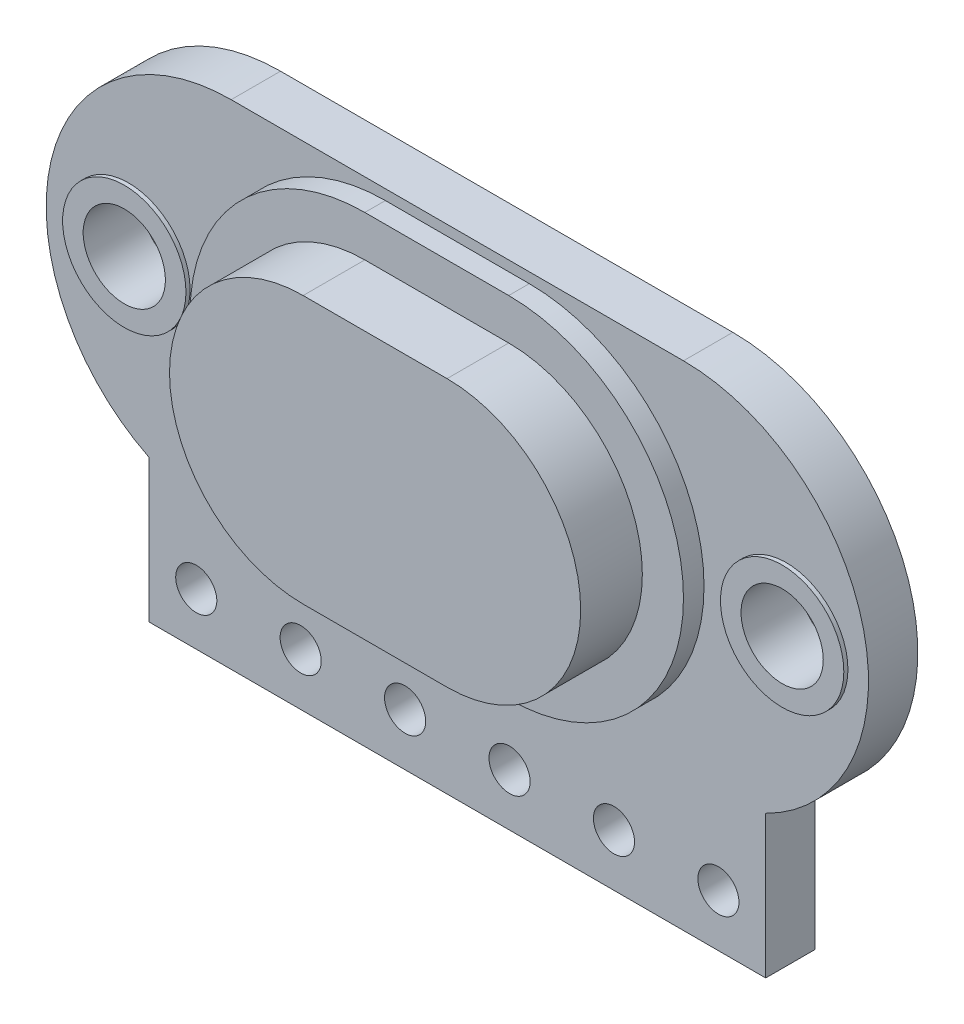
ISO-10303-21;
HEADER;
FILE_DESCRIPTION(('STEP AP214'),'2;1');
FILE_NAME('part.step','',(''),(''),'','','');
FILE_SCHEMA(('AUTOMOTIVE_DESIGN { 1 0 10303 214 1 1 1 1 }'));
ENDSEC;
DATA;
#1=APPLICATION_CONTEXT('core data for automotive mechanical design processes');
#2=APPLICATION_PROTOCOL_DEFINITION('international standard','automotive_design',2000,#1);
#3=PRODUCT_CONTEXT('',#1,'mechanical');
#4=PRODUCT('Part','Part','',(#3));
#5=PRODUCT_RELATED_PRODUCT_CATEGORY('part','',(#4));
#6=PRODUCT_DEFINITION_FORMATION('','',#4);
#7=PRODUCT_DEFINITION_CONTEXT('part definition',#1,'design');
#8=PRODUCT_DEFINITION('design','',#6,#7);
#9=PRODUCT_DEFINITION_SHAPE('','',#8);
#10=(LENGTH_UNIT() NAMED_UNIT(*) SI_UNIT(.MILLI.,.METRE.));
#11=(NAMED_UNIT(*) PLANE_ANGLE_UNIT() SI_UNIT($,.RADIAN.));
#12=(NAMED_UNIT(*) SI_UNIT($,.STERADIAN.) SOLID_ANGLE_UNIT());
#13=UNCERTAINTY_MEASURE_WITH_UNIT(LENGTH_MEASURE(1.E-05),#10,'distance_accuracy_value','');
#14=(GEOMETRIC_REPRESENTATION_CONTEXT(3) GLOBAL_UNCERTAINTY_ASSIGNED_CONTEXT((#13)) GLOBAL_UNIT_ASSIGNED_CONTEXT((#10,
#11,#12)) REPRESENTATION_CONTEXT('',''));
#15=CARTESIAN_POINT('',(0.,0.,0.));
#16=DIRECTION('',(0.,0.,1.));
#17=DIRECTION('',(1.,0.,0.));
#18=AXIS2_PLACEMENT_3D('',#15,#16,#17);
#19=CARTESIAN_POINT('',(-5.5,0.,0.6));
#20=DIRECTION('',(0.,0.,1.));
#21=DIRECTION('',(1.,0.,0.));
#22=AXIS2_PLACEMENT_3D('',#19,#20,#21);
#23=PLANE('',#22);
#24=DIRECTION('',(0.,1.,0.));
#25=VECTOR('',#24,1.);
#26=CARTESIAN_POINT('',(7.5,-4.03112887414927,0.6));
#27=LINE('',#26,#25);
#28=CARTESIAN_POINT('',(7.5,-7.5,0.6));
#29=VERTEX_POINT('',#28);
#30=CARTESIAN_POINT('',(7.5,-4.03112887414928,0.6));
#31=VERTEX_POINT('',#30);
#32=EDGE_CURVE('E234',#29,#31,#27,.T.);
#33=ORIENTED_EDGE('',*,*,#32,.T.);
#34=CARTESIAN_POINT('',(5.5,0.,0.6));
#35=DIRECTION('',(0.,0.,1.));
#36=DIRECTION('',(1.,0.,0.));
#37=AXIS2_PLACEMENT_3D('',#34,#35,#36);
#38=CIRCLE('',#37,4.5);
#39=CARTESIAN_POINT('',(5.5,4.5,0.6));
#40=VERTEX_POINT('',#39);
#41=EDGE_CURVE('E240',#31,#40,#38,.T.);
#42=ORIENTED_EDGE('',*,*,#41,.T.);
#43=DIRECTION('',(-1.,0.,0.));
#44=VECTOR('',#43,1.);
#45=CARTESIAN_POINT('',(-5.5,4.5,0.6));
#46=LINE('',#45,#44);
#47=CARTESIAN_POINT('',(-5.5,4.5,0.6));
#48=VERTEX_POINT('',#47);
#49=EDGE_CURVE('E239',#40,#48,#46,.T.);
#50=ORIENTED_EDGE('',*,*,#49,.T.);
#51=CARTESIAN_POINT('',(-5.5,0.,0.6));
#52=DIRECTION('',(0.,0.,1.));
#53=DIRECTION('',(1.,0.,0.));
#54=AXIS2_PLACEMENT_3D('',#51,#52,#53);
#55=CIRCLE('',#54,4.5);
#56=CARTESIAN_POINT('',(-7.5,-4.03112887414927,0.6));
#57=VERTEX_POINT('',#56);
#58=EDGE_CURVE('E224',#48,#57,#55,.T.);
#59=ORIENTED_EDGE('',*,*,#58,.T.);
#60=DIRECTION('',(0.,-1.,0.));
#61=VECTOR('',#60,1.);
#62=CARTESIAN_POINT('',(-7.5,-4.03112887414927,0.6));
#63=LINE('',#62,#61);
#64=CARTESIAN_POINT('',(-7.5,-7.5,0.6));
#65=VERTEX_POINT('',#64);
#66=EDGE_CURVE('E227',#57,#65,#63,.T.);
#67=ORIENTED_EDGE('',*,*,#66,.T.);
#68=DIRECTION('',(1.,0.,0.));
#69=VECTOR('',#68,1.);
#70=CARTESIAN_POINT('',(-7.5,-7.5,0.6));
#71=LINE('',#70,#69);
#72=EDGE_CURVE('E233',#65,#29,#71,.T.);
#73=ORIENTED_EDGE('',*,*,#72,.T.);
#74=EDGE_LOOP('',(#33,#42,#50,#59,#67,#73));
#75=FACE_BOUND('',#74,.T.);
#76=CARTESIAN_POINT('',(-8.,0.,0.6));
#77=DIRECTION('',(0.,0.,1.));
#78=DIRECTION('',(1.,0.,0.));
#79=AXIS2_PLACEMENT_3D('',#76,#77,#78);
#80=CIRCLE('',#79,1.5);
#81=CARTESIAN_POINT('',(-6.5,0.,0.6));
#82=VERTEX_POINT('',#81);
#83=EDGE_CURVE('E463',#82,#82,#80,.T.);
#84=ORIENTED_EDGE('',*,*,#83,.F.);
#85=EDGE_LOOP('',(#84));
#86=FACE_BOUND('',#85,.T.);
#87=DIRECTION('',(1.,0.,0.));
#88=VECTOR('',#87,1.);
#89=CARTESIAN_POINT('',(-1.75,-4.25,0.6));
#90=LINE('',#89,#88);
#91=CARTESIAN_POINT('',(-1.75,-4.25,0.6));
#92=VERTEX_POINT('',#91);
#93=CARTESIAN_POINT('',(1.75,-4.25,0.6));
#94=VERTEX_POINT('',#93);
#95=EDGE_CURVE('E179',#92,#94,#90,.T.);
#96=ORIENTED_EDGE('',*,*,#95,.F.);
#97=CARTESIAN_POINT('',(-1.75,0.,0.6));
#98=DIRECTION('',(0.,0.,1.));
#99=DIRECTION('',(1.,0.,0.));
#100=AXIS2_PLACEMENT_3D('',#97,#98,#99);
#101=CIRCLE('',#100,4.25);
#102=CARTESIAN_POINT('',(-1.75,4.25,0.6));
#103=VERTEX_POINT('',#102);
#104=EDGE_CURVE('E174',#103,#92,#101,.T.);
#105=ORIENTED_EDGE('',*,*,#104,.F.);
#106=DIRECTION('',(-1.,0.,0.));
#107=VECTOR('',#106,1.);
#108=CARTESIAN_POINT('',(-1.75,4.25,0.6));
#109=LINE('',#108,#107);
#110=CARTESIAN_POINT('',(1.75,4.25,0.6));
#111=VERTEX_POINT('',#110);
#112=EDGE_CURVE('E192',#111,#103,#109,.T.);
#113=ORIENTED_EDGE('',*,*,#112,.F.);
#114=CARTESIAN_POINT('',(1.75,0.,0.6));
#115=DIRECTION('',(0.,0.,1.));
#116=DIRECTION('',(1.,0.,0.));
#117=AXIS2_PLACEMENT_3D('',#114,#115,#116);
#118=CIRCLE('',#117,4.25);
#119=EDGE_CURVE('E204',#94,#111,#118,.T.);
#120=ORIENTED_EDGE('',*,*,#119,.F.);
#121=EDGE_LOOP('',(#96,#105,#113,#120));
#122=FACE_BOUND('',#121,.T.);
#123=CARTESIAN_POINT('',(8.,0.,0.6));
#124=DIRECTION('',(0.,0.,1.));
#125=DIRECTION('',(1.,0.,0.));
#126=AXIS2_PLACEMENT_3D('',#123,#124,#125);
#127=CIRCLE('',#126,1.5);
#128=CARTESIAN_POINT('',(9.5,0.,0.6));
#129=VERTEX_POINT('',#128);
#130=EDGE_CURVE('E455',#129,#129,#127,.T.);
#131=ORIENTED_EDGE('',*,*,#130,.F.);
#132=EDGE_LOOP('',(#131));
#133=FACE_BOUND('',#132,.T.);
#134=CARTESIAN_POINT('',(6.35,-6.23,0.6));
#135=DIRECTION('',(0.,0.,-1.));
#136=DIRECTION('',(-1.,0.,0.));
#137=AXIS2_PLACEMENT_3D('',#134,#135,#136);
#138=CIRCLE('',#137,0.500000000000001);
#139=CARTESIAN_POINT('',(5.85,-6.23,0.6));
#140=VERTEX_POINT('',#139);
#141=EDGE_CURVE('E509',#140,#140,#138,.T.);
#142=ORIENTED_EDGE('',*,*,#141,.T.);
#143=EDGE_LOOP('',(#142));
#144=FACE_BOUND('',#143,.T.);
#145=CARTESIAN_POINT('',(3.81,-6.23,0.6));
#146=DIRECTION('',(0.,0.,-1.));
#147=DIRECTION('',(-1.,0.,0.));
#148=AXIS2_PLACEMENT_3D('',#145,#146,#147);
#149=CIRCLE('',#148,0.500000000000001);
#150=CARTESIAN_POINT('',(3.31,-6.23,0.6));
#151=VERTEX_POINT('',#150);
#152=EDGE_CURVE('E511',#151,#151,#149,.T.);
#153=ORIENTED_EDGE('',*,*,#152,.T.);
#154=EDGE_LOOP('',(#153));
#155=FACE_BOUND('',#154,.T.);
#156=CARTESIAN_POINT('',(1.27,-6.23,0.6));
#157=DIRECTION('',(0.,0.,-1.));
#158=DIRECTION('',(-1.,0.,0.));
#159=AXIS2_PLACEMENT_3D('',#156,#157,#158);
#160=CIRCLE('',#159,0.500000000000001);
#161=CARTESIAN_POINT('',(0.769999999999999,-6.23,0.6));
#162=VERTEX_POINT('',#161);
#163=EDGE_CURVE('E519',#162,#162,#160,.T.);
#164=ORIENTED_EDGE('',*,*,#163,.T.);
#165=EDGE_LOOP('',(#164));
#166=FACE_BOUND('',#165,.T.);
#167=CARTESIAN_POINT('',(-1.27,-6.23,0.6));
#168=DIRECTION('',(0.,0.,-1.));
#169=DIRECTION('',(-1.,0.,0.));
#170=AXIS2_PLACEMENT_3D('',#167,#168,#169);
#171=CIRCLE('',#170,0.500000000000001);
#172=CARTESIAN_POINT('',(-1.77,-6.23,0.6));
#173=VERTEX_POINT('',#172);
#174=EDGE_CURVE('E525',#173,#173,#171,.T.);
#175=ORIENTED_EDGE('',*,*,#174,.T.);
#176=EDGE_LOOP('',(#175));
#177=FACE_BOUND('',#176,.T.);
#178=CARTESIAN_POINT('',(-3.81,-6.23,0.6));
#179=DIRECTION('',(0.,0.,-1.));
#180=DIRECTION('',(-1.,0.,0.));
#181=AXIS2_PLACEMENT_3D('',#178,#179,#180);
#182=CIRCLE('',#181,0.500000000000001);
#183=CARTESIAN_POINT('',(-4.31,-6.23,0.6));
#184=VERTEX_POINT('',#183);
#185=EDGE_CURVE('E526',#184,#184,#182,.T.);
#186=ORIENTED_EDGE('',*,*,#185,.T.);
#187=EDGE_LOOP('',(#186));
#188=FACE_BOUND('',#187,.T.);
#189=CARTESIAN_POINT('',(-6.35,-6.23,0.6));
#190=DIRECTION('',(0.,0.,-1.));
#191=DIRECTION('',(-1.,0.,0.));
#192=AXIS2_PLACEMENT_3D('',#189,#190,#191);
#193=CIRCLE('',#192,0.500000000000001);
#194=CARTESIAN_POINT('',(-6.85,-6.23,0.6));
#195=VERTEX_POINT('',#194);
#196=EDGE_CURVE('E528',#195,#195,#193,.T.);
#197=ORIENTED_EDGE('',*,*,#196,.T.);
#198=EDGE_LOOP('',(#197));
#199=FACE_BOUND('',#198,.T.);
#200=ADVANCED_FACE('F49',(#75,#86,#122,#133,#144,#155,#166,#177,#188,#199),#23,.T.);
#201=CARTESIAN_POINT('',(-5.5,0.,-0.6));
#202=DIRECTION('',(0.,0.,1.));
#203=DIRECTION('',(1.,0.,0.));
#204=AXIS2_PLACEMENT_3D('',#201,#202,#203);
#205=PLANE('',#204);
#206=DIRECTION('',(1.,0.,0.));
#207=VECTOR('',#206,1.);
#208=CARTESIAN_POINT('',(-7.5,-7.5,-0.6));
#209=LINE('',#208,#207);
#210=CARTESIAN_POINT('',(-7.5,-7.5,-0.6));
#211=VERTEX_POINT('',#210);
#212=CARTESIAN_POINT('',(7.5,-7.5,-0.6));
#213=VERTEX_POINT('',#212);
#214=EDGE_CURVE('E249',#211,#213,#209,.T.);
#215=ORIENTED_EDGE('',*,*,#214,.F.);
#216=DIRECTION('',(0.,-1.,0.));
#217=VECTOR('',#216,1.);
#218=CARTESIAN_POINT('',(-7.5,-4.03112887414927,-0.6));
#219=LINE('',#218,#217);
#220=CARTESIAN_POINT('',(-7.5,-4.03112887414927,-0.6));
#221=VERTEX_POINT('',#220);
#222=EDGE_CURVE('E250',#221,#211,#219,.T.);
#223=ORIENTED_EDGE('',*,*,#222,.F.);
#224=CARTESIAN_POINT('',(-5.5,0.,-0.6));
#225=DIRECTION('',(0.,0.,1.));
#226=DIRECTION('',(1.,0.,0.));
#227=AXIS2_PLACEMENT_3D('',#224,#225,#226);
#228=CIRCLE('',#227,4.5);
#229=CARTESIAN_POINT('',(-5.5,4.5,-0.6));
#230=VERTEX_POINT('',#229);
#231=EDGE_CURVE('E222',#230,#221,#228,.T.);
#232=ORIENTED_EDGE('',*,*,#231,.F.);
#233=DIRECTION('',(-1.,0.,0.));
#234=VECTOR('',#233,1.);
#235=CARTESIAN_POINT('',(-5.5,4.5,-0.6));
#236=LINE('',#235,#234);
#237=CARTESIAN_POINT('',(5.5,4.5,-0.6));
#238=VERTEX_POINT('',#237);
#239=EDGE_CURVE('E226',#238,#230,#236,.T.);
#240=ORIENTED_EDGE('',*,*,#239,.F.);
#241=CARTESIAN_POINT('',(5.5,0.,-0.6));
#242=DIRECTION('',(0.,0.,1.));
#243=DIRECTION('',(1.,0.,0.));
#244=AXIS2_PLACEMENT_3D('',#241,#242,#243);
#245=CIRCLE('',#244,4.5);
#246=CARTESIAN_POINT('',(7.5,-4.03112887414928,-0.6));
#247=VERTEX_POINT('',#246);
#248=EDGE_CURVE('E257',#247,#238,#245,.T.);
#249=ORIENTED_EDGE('',*,*,#248,.F.);
#250=DIRECTION('',(0.,1.,0.));
#251=VECTOR('',#250,1.);
#252=CARTESIAN_POINT('',(7.5,-4.03112887414927,-0.6));
#253=LINE('',#252,#251);
#254=EDGE_CURVE('E254',#213,#247,#253,.T.);
#255=ORIENTED_EDGE('',*,*,#254,.F.);
#256=EDGE_LOOP('',(#215,#223,#232,#240,#249,#255));
#257=FACE_BOUND('',#256,.T.);
#258=CARTESIAN_POINT('',(6.35,-6.23,-0.6));
#259=DIRECTION('',(0.,0.,1.));
#260=DIRECTION('',(1.,0.,0.));
#261=AXIS2_PLACEMENT_3D('',#258,#259,#260);
#262=CIRCLE('',#261,0.500000000000001);
#263=CARTESIAN_POINT('',(6.85,-6.23,-0.6));
#264=VERTEX_POINT('',#263);
#265=EDGE_CURVE('E562',#264,#264,#262,.T.);
#266=ORIENTED_EDGE('',*,*,#265,.T.);
#267=EDGE_LOOP('',(#266));
#268=FACE_BOUND('',#267,.T.);
#269=CARTESIAN_POINT('',(3.81,-6.23,-0.6));
#270=DIRECTION('',(0.,0.,1.));
#271=DIRECTION('',(1.,0.,0.));
#272=AXIS2_PLACEMENT_3D('',#269,#270,#271);
#273=CIRCLE('',#272,0.500000000000001);
#274=CARTESIAN_POINT('',(4.31,-6.23,-0.6));
#275=VERTEX_POINT('',#274);
#276=EDGE_CURVE('E557',#275,#275,#273,.T.);
#277=ORIENTED_EDGE('',*,*,#276,.T.);
#278=EDGE_LOOP('',(#277));
#279=FACE_BOUND('',#278,.T.);
#280=CARTESIAN_POINT('',(1.27,-6.23,-0.6));
#281=DIRECTION('',(0.,0.,1.));
#282=DIRECTION('',(1.,0.,0.));
#283=AXIS2_PLACEMENT_3D('',#280,#281,#282);
#284=CIRCLE('',#283,0.500000000000001);
#285=CARTESIAN_POINT('',(1.77,-6.23,-0.6));
#286=VERTEX_POINT('',#285);
#287=EDGE_CURVE('E558',#286,#286,#284,.T.);
#288=ORIENTED_EDGE('',*,*,#287,.T.);
#289=EDGE_LOOP('',(#288));
#290=FACE_BOUND('',#289,.T.);
#291=CARTESIAN_POINT('',(-1.27,-6.23,-0.6));
#292=DIRECTION('',(0.,0.,1.));
#293=DIRECTION('',(1.,0.,0.));
#294=AXIS2_PLACEMENT_3D('',#291,#292,#293);
#295=CIRCLE('',#294,0.500000000000001);
#296=CARTESIAN_POINT('',(-0.769999999999999,-6.23,-0.6));
#297=VERTEX_POINT('',#296);
#298=EDGE_CURVE('E552',#297,#297,#295,.T.);
#299=ORIENTED_EDGE('',*,*,#298,.T.);
#300=EDGE_LOOP('',(#299));
#301=FACE_BOUND('',#300,.T.);
#302=CARTESIAN_POINT('',(-3.81,-6.23,-0.6));
#303=DIRECTION('',(0.,0.,1.));
#304=DIRECTION('',(1.,0.,0.));
#305=AXIS2_PLACEMENT_3D('',#302,#303,#304);
#306=CIRCLE('',#305,0.500000000000001);
#307=CARTESIAN_POINT('',(-3.31,-6.23,-0.6));
#308=VERTEX_POINT('',#307);
#309=EDGE_CURVE('E549',#308,#308,#306,.T.);
#310=ORIENTED_EDGE('',*,*,#309,.T.);
#311=EDGE_LOOP('',(#310));
#312=FACE_BOUND('',#311,.T.);
#313=CARTESIAN_POINT('',(-6.35,-6.23,-0.6));
#314=DIRECTION('',(0.,0.,1.));
#315=DIRECTION('',(1.,0.,0.));
#316=AXIS2_PLACEMENT_3D('',#313,#314,#315);
#317=CIRCLE('',#316,0.500000000000001);
#318=CARTESIAN_POINT('',(-5.85,-6.23,-0.6));
#319=VERTEX_POINT('',#318);
#320=EDGE_CURVE('E544',#319,#319,#317,.T.);
#321=ORIENTED_EDGE('',*,*,#320,.T.);
#322=EDGE_LOOP('',(#321));
#323=FACE_BOUND('',#322,.T.);
#324=CARTESIAN_POINT('',(8.,0.,-0.6));
#325=DIRECTION('',(0.,0.,1.));
#326=DIRECTION('',(1.,0.,0.));
#327=AXIS2_PLACEMENT_3D('',#324,#325,#326);
#328=CIRCLE('',#327,1.5);
#329=CARTESIAN_POINT('',(9.5,0.,-0.6));
#330=VERTEX_POINT('',#329);
#331=EDGE_CURVE('E429',#330,#330,#328,.T.);
#332=ORIENTED_EDGE('',*,*,#331,.T.);
#333=EDGE_LOOP('',(#332));
#334=FACE_BOUND('',#333,.T.);
#335=CARTESIAN_POINT('',(-8.,0.,-0.6));
#336=DIRECTION('',(0.,0.,1.));
#337=DIRECTION('',(1.,0.,0.));
#338=AXIS2_PLACEMENT_3D('',#335,#336,#337);
#339=CIRCLE('',#338,1.5);
#340=CARTESIAN_POINT('',(-6.5,0.,-0.6));
#341=VERTEX_POINT('',#340);
#342=EDGE_CURVE('E432',#341,#341,#339,.T.);
#343=ORIENTED_EDGE('',*,*,#342,.T.);
#344=EDGE_LOOP('',(#343));
#345=FACE_BOUND('',#344,.T.);
#346=ADVANCED_FACE('F286',(#257,#268,#279,#290,#301,#312,#323,#334,#345),#205,.F.);
#347=CARTESIAN_POINT('',(-5.5,0.,0.6));
#348=DIRECTION('',(0.,0.,-1.));
#349=DIRECTION('',(-1.,0.,0.));
#350=AXIS2_PLACEMENT_3D('',#347,#348,#349);
#351=CYLINDRICAL_SURFACE('',#350,4.5);
#352=ORIENTED_EDGE('',*,*,#231,.T.);
#353=DIRECTION('',(0.,0.,-1.));
#354=VECTOR('',#353,1.);
#355=CARTESIAN_POINT('',(-7.5,-4.03112887414927,0.6));
#356=LINE('',#355,#354);
#357=EDGE_CURVE('E11',#57,#221,#356,.T.);
#358=ORIENTED_EDGE('',*,*,#357,.F.);
#359=ORIENTED_EDGE('',*,*,#58,.F.);
#360=DIRECTION('',(0.,0.,-1.));
#361=VECTOR('',#360,1.);
#362=CARTESIAN_POINT('',(-5.5,4.5,0.6));
#363=LINE('',#362,#361);
#364=EDGE_CURVE('E243',#48,#230,#363,.T.);
#365=ORIENTED_EDGE('',*,*,#364,.T.);
#366=EDGE_LOOP('',(#352,#358,#359,#365));
#367=FACE_BOUND('',#366,.T.);
#368=ADVANCED_FACE('F55',(#367),#351,.T.);
#369=CARTESIAN_POINT('',(-7.5,-4.03112887414927,0.6));
#370=DIRECTION('',(1.,0.,0.));
#371=DIRECTION('',(0.,1.,0.));
#372=AXIS2_PLACEMENT_3D('',#369,#370,#371);
#373=PLANE('',#372);
#374=ORIENTED_EDGE('',*,*,#222,.T.);
#375=DIRECTION('',(0.,0.,-1.));
#376=VECTOR('',#375,1.);
#377=CARTESIAN_POINT('',(-7.5,-7.5,0.6));
#378=LINE('',#377,#376);
#379=EDGE_CURVE('E56',#65,#211,#378,.T.);
#380=ORIENTED_EDGE('',*,*,#379,.F.);
#381=ORIENTED_EDGE('',*,*,#66,.F.);
#382=ORIENTED_EDGE('',*,*,#357,.T.);
#383=EDGE_LOOP('',(#374,#380,#381,#382));
#384=FACE_BOUND('',#383,.T.);
#385=ADVANCED_FACE('F304',(#384),#373,.F.);
#386=CARTESIAN_POINT('',(-7.5,-7.5,0.6));
#387=DIRECTION('',(0.,1.,0.));
#388=DIRECTION('',(0.,0.,1.));
#389=AXIS2_PLACEMENT_3D('',#386,#387,#388);
#390=PLANE('',#389);
#391=ORIENTED_EDGE('',*,*,#214,.T.);
#392=DIRECTION('',(0.,0.,-1.));
#393=VECTOR('',#392,1.);
#394=CARTESIAN_POINT('',(7.5,-7.5,0.6));
#395=LINE('',#394,#393);
#396=EDGE_CURVE('E275',#29,#213,#395,.T.);
#397=ORIENTED_EDGE('',*,*,#396,.F.);
#398=ORIENTED_EDGE('',*,*,#72,.F.);
#399=ORIENTED_EDGE('',*,*,#379,.T.);
#400=EDGE_LOOP('',(#391,#397,#398,#399));
#401=FACE_BOUND('',#400,.T.);
#402=ADVANCED_FACE('F282',(#401),#390,.F.);
#403=CARTESIAN_POINT('',(7.5,-4.03112887414927,0.6));
#404=DIRECTION('',(-1.,0.,0.));
#405=DIRECTION('',(0.,-1.,0.));
#406=AXIS2_PLACEMENT_3D('',#403,#404,#405);
#407=PLANE('',#406);
#408=ORIENTED_EDGE('',*,*,#254,.T.);
#409=DIRECTION('',(0.,0.,-1.));
#410=VECTOR('',#409,1.);
#411=CARTESIAN_POINT('',(7.5,-4.03112887414928,0.6));
#412=LINE('',#411,#410);
#413=EDGE_CURVE('E269',#31,#247,#412,.T.);
#414=ORIENTED_EDGE('',*,*,#413,.F.);
#415=ORIENTED_EDGE('',*,*,#32,.F.);
#416=ORIENTED_EDGE('',*,*,#396,.T.);
#417=EDGE_LOOP('',(#408,#414,#415,#416));
#418=FACE_BOUND('',#417,.T.);
#419=ADVANCED_FACE('F291',(#418),#407,.F.);
#420=CARTESIAN_POINT('',(5.5,0.,0.6));
#421=DIRECTION('',(0.,0.,-1.));
#422=DIRECTION('',(-1.,0.,0.));
#423=AXIS2_PLACEMENT_3D('',#420,#421,#422);
#424=CYLINDRICAL_SURFACE('',#423,4.5);
#425=ORIENTED_EDGE('',*,*,#248,.T.);
#426=DIRECTION('',(0.,0.,-1.));
#427=VECTOR('',#426,1.);
#428=CARTESIAN_POINT('',(5.5,4.5,0.6));
#429=LINE('',#428,#427);
#430=EDGE_CURVE('E264',#40,#238,#429,.T.);
#431=ORIENTED_EDGE('',*,*,#430,.F.);
#432=ORIENTED_EDGE('',*,*,#41,.F.);
#433=ORIENTED_EDGE('',*,*,#413,.T.);
#434=EDGE_LOOP('',(#425,#431,#432,#433));
#435=FACE_BOUND('',#434,.T.);
#436=ADVANCED_FACE('F300',(#435),#424,.T.);
#437=CARTESIAN_POINT('',(-5.5,4.5,0.6));
#438=DIRECTION('',(0.,-1.,0.));
#439=DIRECTION('',(0.,0.,-1.));
#440=AXIS2_PLACEMENT_3D('',#437,#438,#439);
#441=PLANE('',#440);
#442=ORIENTED_EDGE('',*,*,#239,.T.);
#443=ORIENTED_EDGE('',*,*,#364,.F.);
#444=ORIENTED_EDGE('',*,*,#49,.F.);
#445=ORIENTED_EDGE('',*,*,#430,.T.);
#446=EDGE_LOOP('',(#442,#443,#444,#445));
#447=FACE_BOUND('',#446,.T.);
#448=ADVANCED_FACE('F308',(#447),#441,.F.);
#449=CARTESIAN_POINT('',(-8.,0.,0.6));
#450=DIRECTION('',(0.,0.,-1.));
#451=DIRECTION('',(-1.,0.,0.));
#452=AXIS2_PLACEMENT_3D('',#449,#450,#451);
#453=CYLINDRICAL_SURFACE('',#452,1.);
#454=CARTESIAN_POINT('',(-8.,0.,0.7));
#455=DIRECTION('',(0.,0.,1.));
#456=DIRECTION('',(1.,0.,0.));
#457=AXIS2_PLACEMENT_3D('',#454,#455,#456);
#458=CIRCLE('',#457,1.);
#459=CARTESIAN_POINT('',(-7.,0.,0.7));
#460=VERTEX_POINT('',#459);
#461=EDGE_CURVE('E460',#460,#460,#458,.T.);
#462=ORIENTED_EDGE('',*,*,#461,.T.);
#463=EDGE_LOOP('',(#462));
#464=FACE_BOUND('',#463,.T.);
#465=CARTESIAN_POINT('',(-8.,0.,-0.7));
#466=DIRECTION('',(0.,0.,1.));
#467=DIRECTION('',(1.,0.,0.));
#468=AXIS2_PLACEMENT_3D('',#465,#466,#467);
#469=CIRCLE('',#468,1.);
#470=CARTESIAN_POINT('',(-7.,0.,-0.7));
#471=VERTEX_POINT('',#470);
#472=EDGE_CURVE('E426',#471,#471,#469,.T.);
#473=ORIENTED_EDGE('',*,*,#472,.F.);
#474=EDGE_LOOP('',(#473));
#475=FACE_BOUND('',#474,.T.);
#476=ADVANCED_FACE('F309',(#464,#475),#453,.F.);
#477=CARTESIAN_POINT('',(8.,0.,0.6));
#478=DIRECTION('',(0.,0.,-1.));
#479=DIRECTION('',(-1.,0.,0.));
#480=AXIS2_PLACEMENT_3D('',#477,#478,#479);
#481=CYLINDRICAL_SURFACE('',#480,1.);
#482=CARTESIAN_POINT('',(8.,0.,0.7));
#483=DIRECTION('',(0.,0.,1.));
#484=DIRECTION('',(1.,0.,0.));
#485=AXIS2_PLACEMENT_3D('',#482,#483,#484);
#486=CIRCLE('',#485,1.);
#487=CARTESIAN_POINT('',(9.,0.,0.7));
#488=VERTEX_POINT('',#487);
#489=EDGE_CURVE('E444',#488,#488,#486,.T.);
#490=ORIENTED_EDGE('',*,*,#489,.T.);
#491=EDGE_LOOP('',(#490));
#492=FACE_BOUND('',#491,.T.);
#493=CARTESIAN_POINT('',(8.,0.,-0.7));
#494=DIRECTION('',(0.,0.,1.));
#495=DIRECTION('',(1.,0.,0.));
#496=AXIS2_PLACEMENT_3D('',#493,#494,#495);
#497=CIRCLE('',#496,1.);
#498=CARTESIAN_POINT('',(9.,0.,-0.7));
#499=VERTEX_POINT('',#498);
#500=EDGE_CURVE('E421',#499,#499,#497,.T.);
#501=ORIENTED_EDGE('',*,*,#500,.F.);
#502=EDGE_LOOP('',(#501));
#503=FACE_BOUND('',#502,.T.);
#504=ADVANCED_FACE('F317',(#492,#503),#481,.F.);
#505=CARTESIAN_POINT('',(-1.75,0.,1.1));
#506=DIRECTION('',(0.,0.,-1.));
#507=DIRECTION('',(-1.,0.,0.));
#508=AXIS2_PLACEMENT_3D('',#505,#506,#507);
#509=CYLINDRICAL_SURFACE('',#508,4.25);
#510=ORIENTED_EDGE('',*,*,#104,.T.);
#511=DIRECTION('',(0.,0.,-1.));
#512=VECTOR('',#511,1.);
#513=CARTESIAN_POINT('',(-1.75,-4.25,1.1));
#514=LINE('',#513,#512);
#515=CARTESIAN_POINT('',(-1.75,-4.25,1.1));
#516=VERTEX_POINT('',#515);
#517=EDGE_CURVE('E219',#516,#92,#514,.T.);
#518=ORIENTED_EDGE('',*,*,#517,.F.);
#519=CARTESIAN_POINT('',(-1.75,0.,1.1));
#520=DIRECTION('',(0.,0.,1.));
#521=DIRECTION('',(1.,0.,0.));
#522=AXIS2_PLACEMENT_3D('',#519,#520,#521);
#523=CIRCLE('',#522,4.25);
#524=CARTESIAN_POINT('',(-1.75,4.25,1.1));
#525=VERTEX_POINT('',#524);
#526=EDGE_CURVE('E187',#525,#516,#523,.T.);
#527=ORIENTED_EDGE('',*,*,#526,.F.);
#528=DIRECTION('',(0.,0.,-1.));
#529=VECTOR('',#528,1.);
#530=CARTESIAN_POINT('',(-1.75,4.25,1.1));
#531=LINE('',#530,#529);
#532=EDGE_CURVE('E199',#525,#103,#531,.T.);
#533=ORIENTED_EDGE('',*,*,#532,.T.);
#534=EDGE_LOOP('',(#510,#518,#527,#533));
#535=FACE_BOUND('',#534,.T.);
#536=ADVANCED_FACE('F335',(#535),#509,.T.);
#537=CARTESIAN_POINT('',(-1.75,-4.25,1.1));
#538=DIRECTION('',(0.,1.,0.));
#539=DIRECTION('',(0.,0.,1.));
#540=AXIS2_PLACEMENT_3D('',#537,#538,#539);
#541=PLANE('',#540);
#542=ORIENTED_EDGE('',*,*,#95,.T.);
#543=DIRECTION('',(0.,0.,-1.));
#544=VECTOR('',#543,1.);
#545=CARTESIAN_POINT('',(1.75,-4.25,1.1));
#546=LINE('',#545,#544);
#547=CARTESIAN_POINT('',(1.75,-4.25,1.1));
#548=VERTEX_POINT('',#547);
#549=EDGE_CURVE('E213',#548,#94,#546,.T.);
#550=ORIENTED_EDGE('',*,*,#549,.F.);
#551=DIRECTION('',(1.,0.,0.));
#552=VECTOR('',#551,1.);
#553=CARTESIAN_POINT('',(-1.75,-4.25,1.1));
#554=LINE('',#553,#552);
#555=EDGE_CURVE('E188',#516,#548,#554,.T.);
#556=ORIENTED_EDGE('',*,*,#555,.F.);
#557=ORIENTED_EDGE('',*,*,#517,.T.);
#558=EDGE_LOOP('',(#542,#550,#556,#557));
#559=FACE_BOUND('',#558,.T.);
#560=ADVANCED_FACE('F360',(#559),#541,.F.);
#561=CARTESIAN_POINT('',(1.75,0.,1.1));
#562=DIRECTION('',(0.,0.,-1.));
#563=DIRECTION('',(-1.,0.,0.));
#564=AXIS2_PLACEMENT_3D('',#561,#562,#563);
#565=CYLINDRICAL_SURFACE('',#564,4.25);
#566=ORIENTED_EDGE('',*,*,#119,.T.);
#567=DIRECTION('',(0.,0.,-1.));
#568=VECTOR('',#567,1.);
#569=CARTESIAN_POINT('',(1.75,4.25,1.1));
#570=LINE('',#569,#568);
#571=CARTESIAN_POINT('',(1.75,4.25,1.1));
#572=VERTEX_POINT('',#571);
#573=EDGE_CURVE('E215',#572,#111,#570,.T.);
#574=ORIENTED_EDGE('',*,*,#573,.F.);
#575=CARTESIAN_POINT('',(1.75,0.,1.1));
#576=DIRECTION('',(0.,0.,1.));
#577=DIRECTION('',(1.,0.,0.));
#578=AXIS2_PLACEMENT_3D('',#575,#576,#577);
#579=CIRCLE('',#578,4.25);
#580=EDGE_CURVE('E191',#548,#572,#579,.T.);
#581=ORIENTED_EDGE('',*,*,#580,.F.);
#582=ORIENTED_EDGE('',*,*,#549,.T.);
#583=EDGE_LOOP('',(#566,#574,#581,#582));
#584=FACE_BOUND('',#583,.T.);
#585=ADVANCED_FACE('F361',(#584),#565,.T.);
#586=CARTESIAN_POINT('',(-1.75,4.25,1.1));
#587=DIRECTION('',(0.,-1.,0.));
#588=DIRECTION('',(0.,0.,-1.));
#589=AXIS2_PLACEMENT_3D('',#586,#587,#588);
#590=PLANE('',#589);
#591=ORIENTED_EDGE('',*,*,#112,.T.);
#592=ORIENTED_EDGE('',*,*,#532,.F.);
#593=DIRECTION('',(-1.,0.,0.));
#594=VECTOR('',#593,1.);
#595=CARTESIAN_POINT('',(-1.75,4.25,1.1));
#596=LINE('',#595,#594);
#597=EDGE_CURVE('E200',#572,#525,#596,.T.);
#598=ORIENTED_EDGE('',*,*,#597,.F.);
#599=ORIENTED_EDGE('',*,*,#573,.T.);
#600=EDGE_LOOP('',(#591,#592,#598,#599));
#601=FACE_BOUND('',#600,.T.);
#602=ADVANCED_FACE('F370',(#601),#590,.F.);
#603=CARTESIAN_POINT('',(-1.75,0.,1.1));
#604=DIRECTION('',(0.,0.,1.));
#605=DIRECTION('',(1.,0.,0.));
#606=AXIS2_PLACEMENT_3D('',#603,#604,#605);
#607=PLANE('',#606);
#608=CARTESIAN_POINT('',(-1.75,0.,1.1));
#609=DIRECTION('',(0.,0.,1.));
#610=DIRECTION('',(1.,0.,0.));
#611=AXIS2_PLACEMENT_3D('',#608,#609,#610);
#612=CIRCLE('',#611,3.25);
#613=CARTESIAN_POINT('',(-1.75,3.25,1.1));
#614=VERTEX_POINT('',#613);
#615=CARTESIAN_POINT('',(-1.75,-3.25,1.1));
#616=VERTEX_POINT('',#615);
#617=EDGE_CURVE('E67',#614,#616,#612,.T.);
#618=ORIENTED_EDGE('',*,*,#617,.F.);
#619=DIRECTION('',(-1.,0.,0.));
#620=VECTOR('',#619,1.);
#621=CARTESIAN_POINT('',(1.75,3.25,1.1));
#622=LINE('',#621,#620);
#623=CARTESIAN_POINT('',(1.75,3.25,1.1));
#624=VERTEX_POINT('',#623);
#625=EDGE_CURVE('E66',#624,#614,#622,.T.);
#626=ORIENTED_EDGE('',*,*,#625,.F.);
#627=CARTESIAN_POINT('',(1.75,0.,1.1));
#628=DIRECTION('',(0.,0.,1.));
#629=DIRECTION('',(1.,0.,0.));
#630=AXIS2_PLACEMENT_3D('',#627,#628,#629);
#631=CIRCLE('',#630,3.25);
#632=CARTESIAN_POINT('',(1.75,-3.25,1.1));
#633=VERTEX_POINT('',#632);
#634=EDGE_CURVE('E482',#633,#624,#631,.T.);
#635=ORIENTED_EDGE('',*,*,#634,.F.);
#636=DIRECTION('',(1.,0.,0.));
#637=VECTOR('',#636,1.);
#638=CARTESIAN_POINT('',(-1.75,-3.25,1.1));
#639=LINE('',#638,#637);
#640=EDGE_CURVE('E479',#616,#633,#639,.T.);
#641=ORIENTED_EDGE('',*,*,#640,.F.);
#642=EDGE_LOOP('',(#618,#626,#635,#641));
#643=FACE_BOUND('',#642,.T.);
#644=ORIENTED_EDGE('',*,*,#526,.T.);
#645=ORIENTED_EDGE('',*,*,#555,.T.);
#646=ORIENTED_EDGE('',*,*,#580,.T.);
#647=ORIENTED_EDGE('',*,*,#597,.T.);
#648=EDGE_LOOP('',(#644,#645,#646,#647));
#649=FACE_BOUND('',#648,.T.);
#650=ADVANCED_FACE('F371',(#643,#649),#607,.T.);
#651=CARTESIAN_POINT('',(-1.75,0.,2.6));
#652=DIRECTION('',(0.,0.,-1.));
#653=DIRECTION('',(-1.,0.,0.));
#654=AXIS2_PLACEMENT_3D('',#651,#652,#653);
#655=CYLINDRICAL_SURFACE('',#654,3.25);
#656=ORIENTED_EDGE('',*,*,#617,.T.);
#657=DIRECTION('',(0.,0.,-1.));
#658=VECTOR('',#657,1.);
#659=CARTESIAN_POINT('',(-1.75,-3.25,2.6));
#660=LINE('',#659,#658);
#661=CARTESIAN_POINT('',(-1.75,-3.25,2.6));
#662=VERTEX_POINT('',#661);
#663=EDGE_CURVE('E151',#662,#616,#660,.T.);
#664=ORIENTED_EDGE('',*,*,#663,.F.);
#665=CARTESIAN_POINT('',(-1.75,0.,2.6));
#666=DIRECTION('',(0.,0.,1.));
#667=DIRECTION('',(1.,0.,0.));
#668=AXIS2_PLACEMENT_3D('',#665,#666,#667);
#669=CIRCLE('',#668,3.25);
#670=CARTESIAN_POINT('',(-1.75,3.25,2.6));
#671=VERTEX_POINT('',#670);
#672=EDGE_CURVE('E162',#671,#662,#669,.T.);
#673=ORIENTED_EDGE('',*,*,#672,.F.);
#674=DIRECTION('',(0.,0.,-1.));
#675=VECTOR('',#674,1.);
#676=CARTESIAN_POINT('',(-1.75,3.25,2.6));
#677=LINE('',#676,#675);
#678=EDGE_CURVE('E477',#671,#614,#677,.T.);
#679=ORIENTED_EDGE('',*,*,#678,.T.);
#680=EDGE_LOOP('',(#656,#664,#673,#679));
#681=FACE_BOUND('',#680,.T.);
#682=ADVANCED_FACE('F173',(#681),#655,.T.);
#683=CARTESIAN_POINT('',(-1.75,-3.25,2.6));
#684=DIRECTION('',(0.,1.,0.));
#685=DIRECTION('',(0.,0.,1.));
#686=AXIS2_PLACEMENT_3D('',#683,#684,#685);
#687=PLANE('',#686);
#688=ORIENTED_EDGE('',*,*,#640,.T.);
#689=DIRECTION('',(0.,0.,-1.));
#690=VECTOR('',#689,1.);
#691=CARTESIAN_POINT('',(1.75,-3.25,2.6));
#692=LINE('',#691,#690);
#693=CARTESIAN_POINT('',(1.75,-3.25,2.6));
#694=VERTEX_POINT('',#693);
#695=EDGE_CURVE('E157',#694,#633,#692,.T.);
#696=ORIENTED_EDGE('',*,*,#695,.F.);
#697=DIRECTION('',(1.,0.,0.));
#698=VECTOR('',#697,1.);
#699=CARTESIAN_POINT('',(-1.75,-3.25,2.6));
#700=LINE('',#699,#698);
#701=EDGE_CURVE('E148',#662,#694,#700,.T.);
#702=ORIENTED_EDGE('',*,*,#701,.F.);
#703=ORIENTED_EDGE('',*,*,#663,.T.);
#704=EDGE_LOOP('',(#688,#696,#702,#703));
#705=FACE_BOUND('',#704,.T.);
#706=ADVANCED_FACE('F153',(#705),#687,.F.);
#707=CARTESIAN_POINT('',(1.75,0.,2.6));
#708=DIRECTION('',(0.,0.,-1.));
#709=DIRECTION('',(-1.,0.,0.));
#710=AXIS2_PLACEMENT_3D('',#707,#708,#709);
#711=CYLINDRICAL_SURFACE('',#710,3.25);
#712=ORIENTED_EDGE('',*,*,#634,.T.);
#713=DIRECTION('',(0.,0.,-1.));
#714=VECTOR('',#713,1.);
#715=CARTESIAN_POINT('',(1.75,3.25,2.6));
#716=LINE('',#715,#714);
#717=CARTESIAN_POINT('',(1.75,3.25,2.6));
#718=VERTEX_POINT('',#717);
#719=EDGE_CURVE('E185',#718,#624,#716,.T.);
#720=ORIENTED_EDGE('',*,*,#719,.F.);
#721=CARTESIAN_POINT('',(1.75,0.,2.6));
#722=DIRECTION('',(0.,0.,1.));
#723=DIRECTION('',(1.,0.,0.));
#724=AXIS2_PLACEMENT_3D('',#721,#722,#723);
#725=CIRCLE('',#724,3.25);
#726=EDGE_CURVE('E163',#694,#718,#725,.T.);
#727=ORIENTED_EDGE('',*,*,#726,.F.);
#728=ORIENTED_EDGE('',*,*,#695,.T.);
#729=EDGE_LOOP('',(#712,#720,#727,#728));
#730=FACE_BOUND('',#729,.T.);
#731=ADVANCED_FACE('F378',(#730),#711,.T.);
#732=CARTESIAN_POINT('',(1.75,3.25,2.6));
#733=DIRECTION('',(0.,-1.,0.));
#734=DIRECTION('',(0.,0.,-1.));
#735=AXIS2_PLACEMENT_3D('',#732,#733,#734);
#736=PLANE('',#735);
#737=ORIENTED_EDGE('',*,*,#625,.T.);
#738=ORIENTED_EDGE('',*,*,#678,.F.);
#739=DIRECTION('',(-1.,0.,0.));
#740=VECTOR('',#739,1.);
#741=CARTESIAN_POINT('',(1.75,3.25,2.6));
#742=LINE('',#741,#740);
#743=EDGE_CURVE('E170',#718,#671,#742,.T.);
#744=ORIENTED_EDGE('',*,*,#743,.F.);
#745=ORIENTED_EDGE('',*,*,#719,.T.);
#746=EDGE_LOOP('',(#737,#738,#744,#745));
#747=FACE_BOUND('',#746,.T.);
#748=ADVANCED_FACE('F385',(#747),#736,.F.);
#749=CARTESIAN_POINT('',(-1.75,0.,2.6));
#750=DIRECTION('',(0.,0.,1.));
#751=DIRECTION('',(1.,0.,0.));
#752=AXIS2_PLACEMENT_3D('',#749,#750,#751);
#753=PLANE('',#752);
#754=ORIENTED_EDGE('',*,*,#672,.T.);
#755=ORIENTED_EDGE('',*,*,#701,.T.);
#756=ORIENTED_EDGE('',*,*,#726,.T.);
#757=ORIENTED_EDGE('',*,*,#743,.T.);
#758=EDGE_LOOP('',(#754,#755,#756,#757));
#759=FACE_BOUND('',#758,.T.);
#760=ADVANCED_FACE('F164',(#759),#753,.T.);
#761=CARTESIAN_POINT('',(-8.,0.,0.7));
#762=DIRECTION('',(0.,0.,1.));
#763=DIRECTION('',(1.,0.,0.));
#764=AXIS2_PLACEMENT_3D('',#761,#762,#763);
#765=PLANE('',#764);
#766=CARTESIAN_POINT('',(-8.,0.,0.7));
#767=DIRECTION('',(0.,0.,1.));
#768=DIRECTION('',(1.,0.,0.));
#769=AXIS2_PLACEMENT_3D('',#766,#767,#768);
#770=CIRCLE('',#769,1.5);
#771=CARTESIAN_POINT('',(-6.5,0.,0.7));
#772=VERTEX_POINT('',#771);
#773=EDGE_CURVE('E465',#772,#772,#770,.T.);
#774=ORIENTED_EDGE('',*,*,#773,.T.);
#775=EDGE_LOOP('',(#774));
#776=FACE_BOUND('',#775,.T.);
#777=ORIENTED_EDGE('',*,*,#461,.F.);
#778=EDGE_LOOP('',(#777));
#779=FACE_BOUND('',#778,.T.);
#780=ADVANCED_FACE('F386',(#776,#779),#765,.T.);
#781=CARTESIAN_POINT('',(-8.,0.,0.7));
#782=DIRECTION('',(0.,0.,-1.));
#783=DIRECTION('',(-1.,0.,0.));
#784=AXIS2_PLACEMENT_3D('',#781,#782,#783);
#785=CYLINDRICAL_SURFACE('',#784,1.5);
#786=ORIENTED_EDGE('',*,*,#773,.F.);
#787=EDGE_LOOP('',(#786));
#788=FACE_BOUND('',#787,.T.);
#789=ORIENTED_EDGE('',*,*,#83,.T.);
#790=EDGE_LOOP('',(#789));
#791=FACE_BOUND('',#790,.T.);
#792=ADVANCED_FACE('F388',(#788,#791),#785,.T.);
#793=CARTESIAN_POINT('',(8.,0.,0.7));
#794=DIRECTION('',(0.,0.,1.));
#795=DIRECTION('',(1.,0.,0.));
#796=AXIS2_PLACEMENT_3D('',#793,#794,#795);
#797=PLANE('',#796);
#798=CARTESIAN_POINT('',(8.,0.,0.7));
#799=DIRECTION('',(0.,0.,1.));
#800=DIRECTION('',(1.,0.,0.));
#801=AXIS2_PLACEMENT_3D('',#798,#799,#800);
#802=CIRCLE('',#801,1.5);
#803=CARTESIAN_POINT('',(9.5,0.,0.7));
#804=VERTEX_POINT('',#803);
#805=EDGE_CURVE('E454',#804,#804,#802,.T.);
#806=ORIENTED_EDGE('',*,*,#805,.T.);
#807=EDGE_LOOP('',(#806));
#808=FACE_BOUND('',#807,.T.);
#809=ORIENTED_EDGE('',*,*,#489,.F.);
#810=EDGE_LOOP('',(#809));
#811=FACE_BOUND('',#810,.T.);
#812=ADVANCED_FACE('F393',(#808,#811),#797,.T.);
#813=CARTESIAN_POINT('',(8.,0.,0.7));
#814=DIRECTION('',(0.,0.,-1.));
#815=DIRECTION('',(-1.,0.,0.));
#816=AXIS2_PLACEMENT_3D('',#813,#814,#815);
#817=CYLINDRICAL_SURFACE('',#816,1.5);
#818=ORIENTED_EDGE('',*,*,#805,.F.);
#819=EDGE_LOOP('',(#818));
#820=FACE_BOUND('',#819,.T.);
#821=ORIENTED_EDGE('',*,*,#130,.T.);
#822=EDGE_LOOP('',(#821));
#823=FACE_BOUND('',#822,.T.);
#824=ADVANCED_FACE('F399',(#820,#823),#817,.T.);
#825=CARTESIAN_POINT('',(-8.,0.,-0.7));
#826=DIRECTION('',(0.,0.,1.));
#827=DIRECTION('',(1.,0.,0.));
#828=AXIS2_PLACEMENT_3D('',#825,#826,#827);
#829=CYLINDRICAL_SURFACE('',#828,1.5);
#830=CARTESIAN_POINT('',(-8.,0.,-0.7));
#831=DIRECTION('',(0.,0.,1.));
#832=DIRECTION('',(1.,0.,0.));
#833=AXIS2_PLACEMENT_3D('',#830,#831,#832);
#834=CIRCLE('',#833,1.5);
#835=CARTESIAN_POINT('',(-6.5,0.,-0.7));
#836=VERTEX_POINT('',#835);
#837=EDGE_CURVE('E441',#836,#836,#834,.T.);
#838=ORIENTED_EDGE('',*,*,#837,.T.);
#839=EDGE_LOOP('',(#838));
#840=FACE_BOUND('',#839,.T.);
#841=ORIENTED_EDGE('',*,*,#342,.F.);
#842=EDGE_LOOP('',(#841));
#843=FACE_BOUND('',#842,.T.);
#844=ADVANCED_FACE('F402',(#840,#843),#829,.T.);
#845=CARTESIAN_POINT('',(-8.,0.,-0.7));
#846=DIRECTION('',(0.,0.,-1.));
#847=DIRECTION('',(1.,0.,0.));
#848=AXIS2_PLACEMENT_3D('',#845,#846,#847);
#849=PLANE('',#848);
#850=ORIENTED_EDGE('',*,*,#472,.T.);
#851=EDGE_LOOP('',(#850));
#852=FACE_BOUND('',#851,.T.);
#853=ORIENTED_EDGE('',*,*,#837,.F.);
#854=EDGE_LOOP('',(#853));
#855=FACE_BOUND('',#854,.T.);
#856=ADVANCED_FACE('F409',(#852,#855),#849,.T.);
#857=CARTESIAN_POINT('',(8.,0.,-0.7));
#858=DIRECTION('',(0.,0.,1.));
#859=DIRECTION('',(1.,0.,0.));
#860=AXIS2_PLACEMENT_3D('',#857,#858,#859);
#861=CYLINDRICAL_SURFACE('',#860,1.5);
#862=CARTESIAN_POINT('',(8.,0.,-0.7));
#863=DIRECTION('',(0.,0.,1.));
#864=DIRECTION('',(1.,0.,0.));
#865=AXIS2_PLACEMENT_3D('',#862,#863,#864);
#866=CIRCLE('',#865,1.5);
#867=CARTESIAN_POINT('',(9.5,0.,-0.7));
#868=VERTEX_POINT('',#867);
#869=EDGE_CURVE('E428',#868,#868,#866,.T.);
#870=ORIENTED_EDGE('',*,*,#869,.T.);
#871=EDGE_LOOP('',(#870));
#872=FACE_BOUND('',#871,.T.);
#873=ORIENTED_EDGE('',*,*,#331,.F.);
#874=EDGE_LOOP('',(#873));
#875=FACE_BOUND('',#874,.T.);
#876=ADVANCED_FACE('F415',(#872,#875),#861,.T.);
#877=CARTESIAN_POINT('',(8.,0.,-0.7));
#878=DIRECTION('',(0.,0.,-1.));
#879=DIRECTION('',(1.,0.,0.));
#880=AXIS2_PLACEMENT_3D('',#877,#878,#879);
#881=PLANE('',#880);
#882=ORIENTED_EDGE('',*,*,#500,.T.);
#883=EDGE_LOOP('',(#882));
#884=FACE_BOUND('',#883,.T.);
#885=ORIENTED_EDGE('',*,*,#869,.F.);
#886=EDGE_LOOP('',(#885));
#887=FACE_BOUND('',#886,.T.);
#888=ADVANCED_FACE('F355',(#884,#887),#881,.T.);
#889=CARTESIAN_POINT('',(6.35,-6.23,0.6));
#890=DIRECTION('',(0.,0.,-1.));
#891=DIRECTION('',(-1.,0.,0.));
#892=AXIS2_PLACEMENT_3D('',#889,#890,#891);
#893=CYLINDRICAL_SURFACE('',#892,0.500000000000001);
#894=ORIENTED_EDGE('',*,*,#265,.F.);
#895=EDGE_LOOP('',(#894));
#896=FACE_BOUND('',#895,.T.);
#897=ORIENTED_EDGE('',*,*,#141,.F.);
#898=EDGE_LOOP('',(#897));
#899=FACE_BOUND('',#898,.T.);
#900=ADVANCED_FACE('F351',(#896,#899),#893,.F.);
#901=CARTESIAN_POINT('',(3.81,-6.23,0.6));
#902=DIRECTION('',(0.,0.,-1.));
#903=DIRECTION('',(-1.,0.,0.));
#904=AXIS2_PLACEMENT_3D('',#901,#902,#903);
#905=CYLINDRICAL_SURFACE('',#904,0.500000000000001);
#906=ORIENTED_EDGE('',*,*,#276,.F.);
#907=EDGE_LOOP('',(#906));
#908=FACE_BOUND('',#907,.T.);
#909=ORIENTED_EDGE('',*,*,#152,.F.);
#910=EDGE_LOOP('',(#909));
#911=FACE_BOUND('',#910,.T.);
#912=ADVANCED_FACE('F350',(#908,#911),#905,.F.);
#913=CARTESIAN_POINT('',(1.27,-6.23,0.6));
#914=DIRECTION('',(0.,0.,-1.));
#915=DIRECTION('',(-1.,0.,0.));
#916=AXIS2_PLACEMENT_3D('',#913,#914,#915);
#917=CYLINDRICAL_SURFACE('',#916,0.500000000000001);
#918=ORIENTED_EDGE('',*,*,#287,.F.);
#919=EDGE_LOOP('',(#918));
#920=FACE_BOUND('',#919,.T.);
#921=ORIENTED_EDGE('',*,*,#163,.F.);
#922=EDGE_LOOP('',(#921));
#923=FACE_BOUND('',#922,.T.);
#924=ADVANCED_FACE('F344',(#920,#923),#917,.F.);
#925=CARTESIAN_POINT('',(-1.27,-6.23,0.6));
#926=DIRECTION('',(0.,0.,-1.));
#927=DIRECTION('',(-1.,0.,0.));
#928=AXIS2_PLACEMENT_3D('',#925,#926,#927);
#929=CYLINDRICAL_SURFACE('',#928,0.500000000000001);
#930=ORIENTED_EDGE('',*,*,#298,.F.);
#931=EDGE_LOOP('',(#930));
#932=FACE_BOUND('',#931,.T.);
#933=ORIENTED_EDGE('',*,*,#174,.F.);
#934=EDGE_LOOP('',(#933));
#935=FACE_BOUND('',#934,.T.);
#936=ADVANCED_FACE('F339',(#932,#935),#929,.F.);
#937=CARTESIAN_POINT('',(-3.81,-6.23,0.6));
#938=DIRECTION('',(0.,0.,-1.));
#939=DIRECTION('',(-1.,0.,0.));
#940=AXIS2_PLACEMENT_3D('',#937,#938,#939);
#941=CYLINDRICAL_SURFACE('',#940,0.500000000000001);
#942=ORIENTED_EDGE('',*,*,#309,.F.);
#943=EDGE_LOOP('',(#942));
#944=FACE_BOUND('',#943,.T.);
#945=ORIENTED_EDGE('',*,*,#185,.F.);
#946=EDGE_LOOP('',(#945));
#947=FACE_BOUND('',#946,.T.);
#948=ADVANCED_FACE('F331',(#944,#947),#941,.F.);
#949=CARTESIAN_POINT('',(-6.35,-6.23,0.6));
#950=DIRECTION('',(0.,0.,-1.));
#951=DIRECTION('',(-1.,0.,0.));
#952=AXIS2_PLACEMENT_3D('',#949,#950,#951);
#953=CYLINDRICAL_SURFACE('',#952,0.500000000000001);
#954=ORIENTED_EDGE('',*,*,#320,.F.);
#955=EDGE_LOOP('',(#954));
#956=FACE_BOUND('',#955,.T.);
#957=ORIENTED_EDGE('',*,*,#196,.F.);
#958=EDGE_LOOP('',(#957));
#959=FACE_BOUND('',#958,.T.);
#960=ADVANCED_FACE('F328',(#956,#959),#953,.F.);
#961=CLOSED_SHELL('',(#200,#346,#368,#385,#402,#419,#436,#448,#476,#504,#536,#560,#585,#602,
#650,#682,#706,#731,#748,#760,#780,#792,#812,#824,#844,#856,#876,#888,#900,#912,#924,#936,#948,#960));
#962=MANIFOLD_SOLID_BREP('B2',#961);
#963=ADVANCED_BREP_SHAPE_REPRESENTATION('',(#18,#962),#14);
#964=SHAPE_DEFINITION_REPRESENTATION(#9,#963);
ENDSEC;
END-ISO-10303-21;
